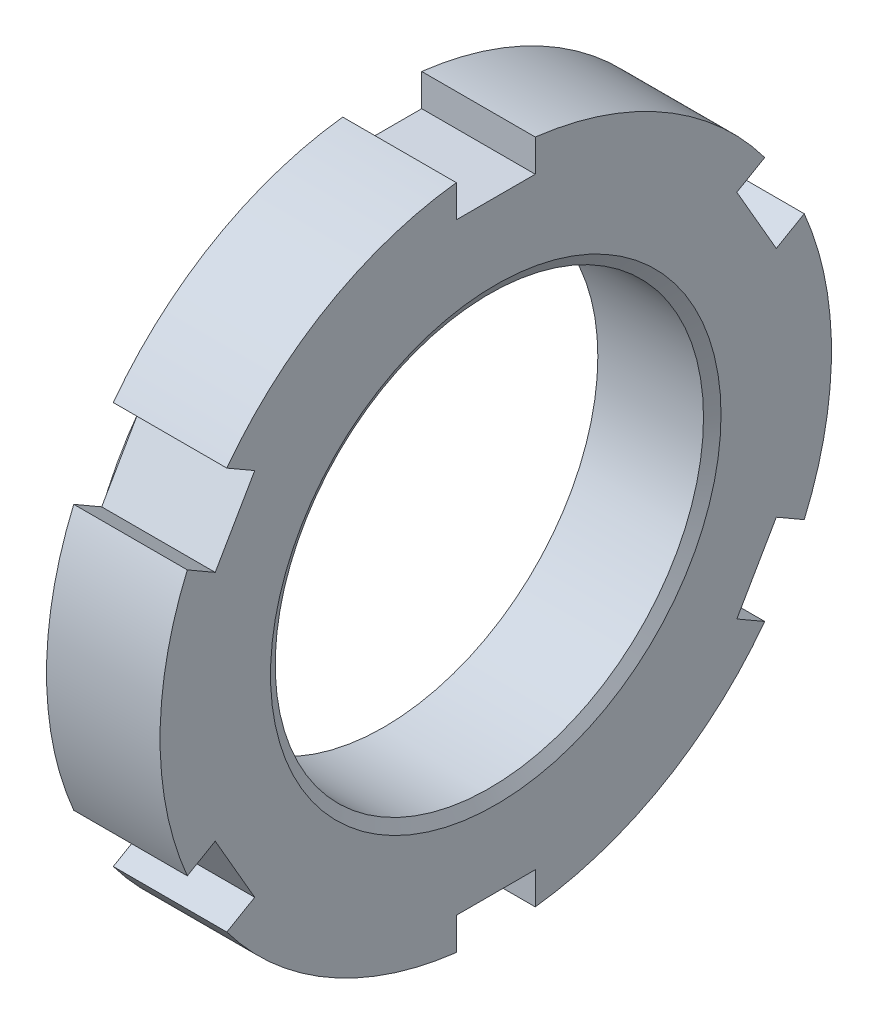
ISO-10303-21;
HEADER;
FILE_DESCRIPTION(('STEP AP214'),'2;1');
FILE_NAME('part.step','',(''),(''),'','','');
FILE_SCHEMA(('AUTOMOTIVE_DESIGN { 1 0 10303 214 1 1 1 1 }'));
ENDSEC;
DATA;
#1=APPLICATION_CONTEXT('core data for automotive mechanical design processes');
#2=APPLICATION_PROTOCOL_DEFINITION('international standard','automotive_design',2000,#1);
#3=PRODUCT_CONTEXT('',#1,'mechanical');
#4=PRODUCT('Part','Part','',(#3));
#5=PRODUCT_RELATED_PRODUCT_CATEGORY('part','',(#4));
#6=PRODUCT_DEFINITION_FORMATION('','',#4);
#7=PRODUCT_DEFINITION_CONTEXT('part definition',#1,'design');
#8=PRODUCT_DEFINITION('design','',#6,#7);
#9=PRODUCT_DEFINITION_SHAPE('','',#8);
#10=(LENGTH_UNIT() NAMED_UNIT(*) SI_UNIT(.MILLI.,.METRE.));
#11=(NAMED_UNIT(*) PLANE_ANGLE_UNIT() SI_UNIT($,.RADIAN.));
#12=(NAMED_UNIT(*) SI_UNIT($,.STERADIAN.) SOLID_ANGLE_UNIT());
#13=UNCERTAINTY_MEASURE_WITH_UNIT(LENGTH_MEASURE(1.E-05),#10,'distance_accuracy_value','');
#14=(GEOMETRIC_REPRESENTATION_CONTEXT(3) GLOBAL_UNCERTAINTY_ASSIGNED_CONTEXT((#13)) GLOBAL_UNIT_ASSIGNED_CONTEXT((#10,
#11,#12)) REPRESENTATION_CONTEXT('',''));
#15=CARTESIAN_POINT('',(0.,0.,0.));
#16=DIRECTION('',(0.,0.,1.));
#17=DIRECTION('',(1.,0.,0.));
#18=AXIS2_PLACEMENT_3D('',#15,#16,#17);
#19=CARTESIAN_POINT('',(0.5,32.,0.));
#20=DIRECTION('',(-1.,0.,0.));
#21=DIRECTION('',(0.,0.,1.));
#22=AXIS2_PLACEMENT_3D('',#19,#20,#21);
#23=PLANE('',#22);
#24=CARTESIAN_POINT('',(0.5,0.,0.));
#25=DIRECTION('',(1.,0.,0.));
#26=DIRECTION('',(0.,1.,0.));
#27=AXIS2_PLACEMENT_3D('',#24,#25,#26);
#28=CIRCLE('',#27,30.);
#29=CARTESIAN_POINT('',(0.5,-30.,0.));
#30=VERTEX_POINT('',#29);
#31=EDGE_CURVE('E28',#30,#30,#28,.T.);
#32=ORIENTED_EDGE('',*,*,#31,.T.);
#33=EDGE_LOOP('',(#32));
#34=FACE_BOUND('',#33,.T.);
#35=DIRECTION('',(0.,-0.5,-0.866025403784439));
#36=VECTOR('',#35,1.);
#37=CARTESIAN_POINT('',(0.5,-7.08910161513776,-4.27868417743718));
#38=LINE('',#37,#36);
#39=CARTESIAN_POINT('',(0.5,-18.7141016151378,-24.4137748154254));
#40=VERTEX_POINT('',#39);
#41=CARTESIAN_POINT('',(0.5,-20.3460446312719,-27.2403830344269));
#42=VERTEX_POINT('',#41);
#43=EDGE_CURVE('E310',#40,#42,#38,.T.);
#44=ORIENTED_EDGE('',*,*,#43,.T.);
#45=CARTESIAN_POINT('',(0.5,0.,0.));
#46=DIRECTION('',(1.,0.,0.));
#47=DIRECTION('',(0.,1.,0.));
#48=AXIS2_PLACEMENT_3D('',#45,#46,#47);
#49=CIRCLE('',#48,34.);
#50=CARTESIAN_POINT('',(0.5,-33.7638860322683,-4.));
#51=VERTEX_POINT('',#50);
#52=EDGE_CURVE('E332',#51,#42,#49,.T.);
#53=ORIENTED_EDGE('',*,*,#52,.F.);
#54=DIRECTION('',(0.,1.,0.));
#55=VECTOR('',#54,1.);
#56=CARTESIAN_POINT('',(0.5,-0.881943016134133,-4.));
#57=LINE('',#56,#55);
#58=CARTESIAN_POINT('',(0.5,-30.5,-4.));
#59=VERTEX_POINT('',#58);
#60=EDGE_CURVE('E322',#51,#59,#57,.T.);
#61=ORIENTED_EDGE('',*,*,#60,.T.);
#62=DIRECTION('',(0.,0.,1.));
#63=VECTOR('',#62,1.);
#64=CARTESIAN_POINT('',(0.5,-30.5,-2.));
#65=LINE('',#64,#63);
#66=CARTESIAN_POINT('',(0.5,-30.5,4.));
#67=VERTEX_POINT('',#66);
#68=EDGE_CURVE('E248',#59,#67,#65,.T.);
#69=ORIENTED_EDGE('',*,*,#68,.T.);
#70=DIRECTION('',(0.,-1.,0.));
#71=VECTOR('',#70,1.);
#72=CARTESIAN_POINT('',(0.5,0.75,4.));
#73=LINE('',#72,#71);
#74=CARTESIAN_POINT('',(0.5,-33.7638860322683,4.));
#75=VERTEX_POINT('',#74);
#76=EDGE_CURVE('E413',#67,#75,#73,.T.);
#77=ORIENTED_EDGE('',*,*,#76,.T.);
#78=CARTESIAN_POINT('',(0.5,0.,0.));
#79=DIRECTION('',(1.,0.,0.));
#80=DIRECTION('',(0.,1.,0.));
#81=AXIS2_PLACEMENT_3D('',#78,#79,#80);
#82=CIRCLE('',#81,34.);
#83=CARTESIAN_POINT('',(0.5,-20.3460446312719,27.2403830344269));
#84=VERTEX_POINT('',#83);
#85=EDGE_CURVE('E293',#84,#75,#82,.T.);
#86=ORIENTED_EDGE('',*,*,#85,.F.);
#87=DIRECTION('',(0.,0.5,-0.866025403784439));
#88=VECTOR('',#87,1.);
#89=CARTESIAN_POINT('',(0.5,-7.90507312320482,5.69198828693794));
#90=LINE('',#89,#88);
#91=CARTESIAN_POINT('',(0.5,-18.7141016151378,24.4137748154254));
#92=VERTEX_POINT('',#91);
#93=EDGE_CURVE('E226',#84,#92,#90,.T.);
#94=ORIENTED_EDGE('',*,*,#93,.T.);
#95=DIRECTION('',(0.,0.866025403784439,0.5));
#96=VECTOR('',#95,1.);
#97=CARTESIAN_POINT('',(0.5,-4.98205080756887,32.3419780457009));
#98=LINE('',#97,#96);
#99=CARTESIAN_POINT('',(0.5,-11.7858983848622,28.4137748154254));
#100=VERTEX_POINT('',#99);
#101=EDGE_CURVE('E267',#92,#100,#98,.T.);
#102=ORIENTED_EDGE('',*,*,#101,.T.);
#103=DIRECTION('',(0.,-0.5,0.866025403784439));
#104=VECTOR('',#103,1.);
#105=CARTESIAN_POINT('',(0.5,-0.160898384862247,8.27868417743719));
#106=LINE('',#105,#104);
#107=CARTESIAN_POINT('',(0.5,-13.4178414009964,31.2403830344269));
#108=VERTEX_POINT('',#107);
#109=EDGE_CURVE('E442',#100,#108,#106,.T.);
#110=ORIENTED_EDGE('',*,*,#109,.T.);
#111=CARTESIAN_POINT('',(0.5,0.,0.));
#112=DIRECTION('',(1.,0.,0.));
#113=DIRECTION('',(0.,1.,0.));
#114=AXIS2_PLACEMENT_3D('',#111,#112,#113);
#115=CIRCLE('',#114,34.);
#116=CARTESIAN_POINT('',(0.5,13.4178414009964,31.2403830344269));
#117=VERTEX_POINT('',#116);
#118=EDGE_CURVE('E290',#117,#108,#115,.T.);
#119=ORIENTED_EDGE('',*,*,#118,.F.);
#120=DIRECTION('',(0.,-0.5,-0.866025403784439));
#121=VECTOR('',#120,1.);
#122=CARTESIAN_POINT('',(0.5,8.97686989292931,23.548394747489));
#123=LINE('',#122,#121);
#124=CARTESIAN_POINT('',(0.5,11.7858983848623,28.4137748154254));
#125=VERTEX_POINT('',#124);
#126=EDGE_CURVE('E198',#117,#125,#123,.T.);
#127=ORIENTED_EDGE('',*,*,#126,.T.);
#128=DIRECTION('',(0.,0.866025403784439,-0.5));
#129=VECTOR('',#128,1.);
#130=CARTESIAN_POINT('',(0.5,25.5179491924311,20.4855715851499));
#131=LINE('',#130,#129);
#132=CARTESIAN_POINT('',(0.5,18.7141016151378,24.4137748154254));
#133=VERTEX_POINT('',#132);
#134=EDGE_CURVE('E190',#125,#133,#131,.T.);
#135=ORIENTED_EDGE('',*,*,#134,.T.);
#136=DIRECTION('',(0.,0.5,0.866025403784439));
#137=VECTOR('',#136,1.);
#138=CARTESIAN_POINT('',(0.5,15.0891016151378,18.1350906379882));
#139=LINE('',#138,#137);
#140=CARTESIAN_POINT('',(0.5,20.3460446312719,27.2403830344269));
#141=VERTEX_POINT('',#140);
#142=EDGE_CURVE('E195',#133,#141,#139,.T.);
#143=ORIENTED_EDGE('',*,*,#142,.T.);
#144=CARTESIAN_POINT('',(0.5,0.,0.));
#145=DIRECTION('',(1.,0.,0.));
#146=DIRECTION('',(0.,1.,0.));
#147=AXIS2_PLACEMENT_3D('',#144,#145,#146);
#148=CIRCLE('',#147,34.);
#149=CARTESIAN_POINT('',(0.5,33.7638860322683,4.));
#150=VERTEX_POINT('',#149);
#151=EDGE_CURVE('E294',#150,#141,#148,.T.);
#152=ORIENTED_EDGE('',*,*,#151,.F.);
#153=DIRECTION('',(0.,-1.,0.));
#154=VECTOR('',#153,1.);
#155=CARTESIAN_POINT('',(0.5,32.8819430161341,4.));
#156=LINE('',#155,#154);
#157=CARTESIAN_POINT('',(0.5,30.5,4.));
#158=VERTEX_POINT('',#157);
#159=EDGE_CURVE('E299',#150,#158,#156,.T.);
#160=ORIENTED_EDGE('',*,*,#159,.T.);
#161=DIRECTION('',(0.,0.,-1.));
#162=VECTOR('',#161,1.);
#163=CARTESIAN_POINT('',(0.5,30.5,2.));
#164=LINE('',#163,#162);
#165=CARTESIAN_POINT('',(0.5,30.5,-4.));
#166=VERTEX_POINT('',#165);
#167=EDGE_CURVE('E300',#158,#166,#164,.T.);
#168=ORIENTED_EDGE('',*,*,#167,.T.);
#169=DIRECTION('',(0.,1.,0.));
#170=VECTOR('',#169,1.);
#171=CARTESIAN_POINT('',(0.5,31.25,-4.));
#172=LINE('',#171,#170);
#173=CARTESIAN_POINT('',(0.5,33.7638860322683,-4.));
#174=VERTEX_POINT('',#173);
#175=EDGE_CURVE('E417',#166,#174,#172,.T.);
#176=ORIENTED_EDGE('',*,*,#175,.T.);
#177=CARTESIAN_POINT('',(0.5,0.,0.));
#178=DIRECTION('',(1.,0.,0.));
#179=DIRECTION('',(0.,1.,0.));
#180=AXIS2_PLACEMENT_3D('',#177,#178,#179);
#181=CIRCLE('',#180,34.);
#182=CARTESIAN_POINT('',(0.5,20.3460446312719,-27.2403830344269));
#183=VERTEX_POINT('',#182);
#184=EDGE_CURVE('E301',#183,#174,#181,.T.);
#185=ORIENTED_EDGE('',*,*,#184,.F.);
#186=DIRECTION('',(0.,-0.5,0.866025403784439));
#187=VECTOR('',#186,1.);
#188=CARTESIAN_POINT('',(0.5,15.9050731232048,-19.548394747489));
#189=LINE('',#188,#187);
#190=CARTESIAN_POINT('',(0.5,18.7141016151377,-24.4137748154254));
#191=VERTEX_POINT('',#190);
#192=EDGE_CURVE('E283',#183,#191,#189,.T.);
#193=ORIENTED_EDGE('',*,*,#192,.T.);
#194=DIRECTION('',(0.,-0.866025403784439,-0.5));
#195=VECTOR('',#194,1.);
#196=CARTESIAN_POINT('',(0.5,28.9820508075689,-18.4855715851499));
#197=LINE('',#196,#195);
#198=CARTESIAN_POINT('',(0.5,11.7858983848622,-28.4137748154254));
#199=VERTEX_POINT('',#198);
#200=EDGE_CURVE('E284',#191,#199,#197,.T.);
#201=ORIENTED_EDGE('',*,*,#200,.T.);
#202=DIRECTION('',(0.,0.5,-0.866025403784439));
#203=VECTOR('',#202,1.);
#204=CARTESIAN_POINT('',(0.5,8.16089838486222,-22.1350906379882));
#205=LINE('',#204,#203);
#206=CARTESIAN_POINT('',(0.5,13.4178414009964,-31.2403830344269));
#207=VERTEX_POINT('',#206);
#208=EDGE_CURVE('E235',#199,#207,#205,.T.);
#209=ORIENTED_EDGE('',*,*,#208,.T.);
#210=CARTESIAN_POINT('',(0.5,0.,0.));
#211=DIRECTION('',(1.,0.,0.));
#212=DIRECTION('',(0.,1.,0.));
#213=AXIS2_PLACEMENT_3D('',#210,#211,#212);
#214=CIRCLE('',#213,34.);
#215=CARTESIAN_POINT('',(0.5,-13.4178414009964,-31.2403830344269));
#216=VERTEX_POINT('',#215);
#217=EDGE_CURVE('E414',#216,#207,#214,.T.);
#218=ORIENTED_EDGE('',*,*,#217,.F.);
#219=DIRECTION('',(0.,0.5,0.866025403784439));
#220=VECTOR('',#219,1.);
#221=CARTESIAN_POINT('',(0.5,-0.976869892929313,-9.69198828693793));
#222=LINE('',#221,#220);
#223=CARTESIAN_POINT('',(0.5,-11.7858983848623,-28.4137748154254));
#224=VERTEX_POINT('',#223);
#225=EDGE_CURVE('E273',#216,#224,#222,.T.);
#226=ORIENTED_EDGE('',*,*,#225,.T.);
#227=DIRECTION('',(0.,-0.866025403784439,0.5));
#228=VECTOR('',#227,1.);
#229=CARTESIAN_POINT('',(0.5,-1.51794919243114,-34.3419780457009));
#230=LINE('',#229,#228);
#231=EDGE_CURVE('E246',#224,#40,#230,.T.);
#232=ORIENTED_EDGE('',*,*,#231,.T.);
#233=EDGE_LOOP('',(#44,#53,#61,#69,#77,#86,#94,#102,#110,#119,#127,#135,#143,#152,#160,#168,
#176,#185,#193,#201,#209,#218,#226,#232));
#234=FACE_BOUND('',#233,.T.);
#235=ADVANCED_FACE('F17',(#34,#234),#23,.T.);
#236=CARTESIAN_POINT('',(0.25,0.,0.));
#237=DIRECTION('',(1.,0.,0.));
#238=DIRECTION('',(0.,1.,0.));
#239=AXIS2_PLACEMENT_3D('',#236,#237,#238);
#240=CYLINDRICAL_SURFACE('',#239,30.);
#241=ORIENTED_EDGE('',*,*,#31,.F.);
#242=DIRECTION('',(-1.,0.,0.));
#243=VECTOR('',#242,1.);
#244=CARTESIAN_POINT('',(0.25,-30.,0.));
#245=LINE('',#244,#243);
#246=CARTESIAN_POINT('',(0.,-30.,0.));
#247=VERTEX_POINT('',#246);
#248=EDGE_CURVE('E11',#30,#247,#245,.T.);
#249=ORIENTED_EDGE('',*,*,#248,.T.);
#250=CARTESIAN_POINT('',(0.,0.,0.));
#251=DIRECTION('',(1.,0.,0.));
#252=DIRECTION('',(0.,1.,0.));
#253=AXIS2_PLACEMENT_3D('',#250,#251,#252);
#254=CIRCLE('',#253,30.);
#255=EDGE_CURVE('E364',#247,#247,#254,.T.);
#256=ORIENTED_EDGE('',*,*,#255,.T.);
#257=ORIENTED_EDGE('',*,*,#248,.F.);
#258=EDGE_LOOP('',(#241,#249,#256,#257));
#259=FACE_BOUND('',#258,.T.);
#260=ADVANCED_FACE('F649',(#259),#240,.T.);
#261=CARTESIAN_POINT('',(6.25,0.,0.));
#262=DIRECTION('',(1.,0.,0.));
#263=DIRECTION('',(0.,1.,0.));
#264=AXIS2_PLACEMENT_3D('',#261,#262,#263);
#265=CYLINDRICAL_SURFACE('',#264,34.);
#266=DIRECTION('',(1.,0.,0.));
#267=VECTOR('',#266,1.);
#268=CARTESIAN_POINT('',(6.25,-20.3460446312719,-27.2403830344269));
#269=LINE('',#268,#267);
#270=CARTESIAN_POINT('',(12.,-20.3460446312719,-27.2403830344269));
#271=VERTEX_POINT('',#270);
#272=EDGE_CURVE('E242',#42,#271,#269,.T.);
#273=ORIENTED_EDGE('',*,*,#272,.T.);
#274=CARTESIAN_POINT('',(12.,0.,0.));
#275=DIRECTION('',(1.,0.,0.));
#276=DIRECTION('',(0.,1.,0.));
#277=AXIS2_PLACEMENT_3D('',#274,#275,#276);
#278=CIRCLE('',#277,34.);
#279=CARTESIAN_POINT('',(12.,-33.7638860322683,-4.));
#280=VERTEX_POINT('',#279);
#281=EDGE_CURVE('E347',#280,#271,#278,.T.);
#282=ORIENTED_EDGE('',*,*,#281,.F.);
#283=DIRECTION('',(-1.,0.,0.));
#284=VECTOR('',#283,1.);
#285=CARTESIAN_POINT('',(6.25,-33.7638860322683,-4.));
#286=LINE('',#285,#284);
#287=EDGE_CURVE('E446',#280,#51,#286,.T.);
#288=ORIENTED_EDGE('',*,*,#287,.T.);
#289=ORIENTED_EDGE('',*,*,#52,.T.);
#290=EDGE_LOOP('',(#273,#282,#288,#289));
#291=FACE_BOUND('',#290,.T.);
#292=ADVANCED_FACE('F611',(#291),#265,.T.);
#293=CARTESIAN_POINT('',(12.,33.7638860322683,4.));
#294=DIRECTION('',(0.,0.,1.));
#295=DIRECTION('',(1.,0.,0.));
#296=AXIS2_PLACEMENT_3D('',#293,#294,#295);
#297=PLANE('',#296);
#298=ORIENTED_EDGE('',*,*,#159,.F.);
#299=DIRECTION('',(-1.,0.,0.));
#300=VECTOR('',#299,1.);
#301=CARTESIAN_POINT('',(6.25,33.7638860322683,4.));
#302=LINE('',#301,#300);
#303=CARTESIAN_POINT('',(12.,33.7638860322683,4.));
#304=VERTEX_POINT('',#303);
#305=EDGE_CURVE('E315',#304,#150,#302,.T.);
#306=ORIENTED_EDGE('',*,*,#305,.F.);
#307=DIRECTION('',(0.,1.,0.));
#308=VECTOR('',#307,1.);
#309=CARTESIAN_POINT('',(12.,25.3819430161341,4.));
#310=LINE('',#309,#308);
#311=CARTESIAN_POINT('',(12.,30.5,4.));
#312=VERTEX_POINT('',#311);
#313=EDGE_CURVE('E236',#312,#304,#310,.T.);
#314=ORIENTED_EDGE('',*,*,#313,.F.);
#315=DIRECTION('',(-1.,0.,0.));
#316=VECTOR('',#315,1.);
#317=CARTESIAN_POINT('',(12.,30.5,4.));
#318=LINE('',#317,#316);
#319=EDGE_CURVE('E295',#312,#158,#318,.T.);
#320=ORIENTED_EDGE('',*,*,#319,.T.);
#321=EDGE_LOOP('',(#298,#306,#314,#320));
#322=FACE_BOUND('',#321,.T.);
#323=ADVANCED_FACE('F709',(#322),#297,.F.);
#324=CARTESIAN_POINT('',(12.,30.5,4.));
#325=DIRECTION('',(0.,-1.,0.));
#326=DIRECTION('',(0.,0.,-1.));
#327=AXIS2_PLACEMENT_3D('',#324,#325,#326);
#328=PLANE('',#327);
#329=ORIENTED_EDGE('',*,*,#167,.F.);
#330=ORIENTED_EDGE('',*,*,#319,.F.);
#331=DIRECTION('',(0.,0.,1.));
#332=VECTOR('',#331,1.);
#333=CARTESIAN_POINT('',(12.,30.5,2.));
#334=LINE('',#333,#332);
#335=CARTESIAN_POINT('',(12.,30.5,-4.));
#336=VERTEX_POINT('',#335);
#337=EDGE_CURVE('E240',#336,#312,#334,.T.);
#338=ORIENTED_EDGE('',*,*,#337,.F.);
#339=DIRECTION('',(-1.,0.,0.));
#340=VECTOR('',#339,1.);
#341=CARTESIAN_POINT('',(12.,30.5,-4.));
#342=LINE('',#341,#340);
#343=EDGE_CURVE('E331',#336,#166,#342,.T.);
#344=ORIENTED_EDGE('',*,*,#343,.T.);
#345=EDGE_LOOP('',(#329,#330,#338,#344));
#346=FACE_BOUND('',#345,.T.);
#347=ADVANCED_FACE('F644',(#346),#328,.F.);
#348=CARTESIAN_POINT('',(12.,30.5,-4.));
#349=DIRECTION('',(0.,0.,-1.));
#350=DIRECTION('',(0.,-1.,0.));
#351=AXIS2_PLACEMENT_3D('',#348,#349,#350);
#352=PLANE('',#351);
#353=ORIENTED_EDGE('',*,*,#175,.F.);
#354=ORIENTED_EDGE('',*,*,#343,.F.);
#355=DIRECTION('',(0.,-1.,0.));
#356=VECTOR('',#355,1.);
#357=CARTESIAN_POINT('',(12.,23.75,-4.));
#358=LINE('',#357,#356);
#359=CARTESIAN_POINT('',(12.,33.7638860322683,-4.));
#360=VERTEX_POINT('',#359);
#361=EDGE_CURVE('E254',#360,#336,#358,.T.);
#362=ORIENTED_EDGE('',*,*,#361,.F.);
#363=DIRECTION('',(1.,0.,0.));
#364=VECTOR('',#363,1.);
#365=CARTESIAN_POINT('',(6.25,33.7638860322683,-4.));
#366=LINE('',#365,#364);
#367=EDGE_CURVE('E305',#174,#360,#366,.T.);
#368=ORIENTED_EDGE('',*,*,#367,.F.);
#369=EDGE_LOOP('',(#353,#354,#362,#368));
#370=FACE_BOUND('',#369,.T.);
#371=ADVANCED_FACE('F634',(#370),#352,.F.);
#372=CARTESIAN_POINT('',(6.25,0.,0.));
#373=DIRECTION('',(1.,0.,0.));
#374=DIRECTION('',(0.,1.,0.));
#375=AXIS2_PLACEMENT_3D('',#372,#373,#374);
#376=CYLINDRICAL_SURFACE('',#375,34.);
#377=DIRECTION('',(-1.,0.,0.));
#378=VECTOR('',#377,1.);
#379=CARTESIAN_POINT('',(6.25,-13.4178414009964,-31.2403830344269));
#380=LINE('',#379,#378);
#381=CARTESIAN_POINT('',(12.,-13.4178414009964,-31.2403830344269));
#382=VERTEX_POINT('',#381);
#383=EDGE_CURVE('E277',#382,#216,#380,.T.);
#384=ORIENTED_EDGE('',*,*,#383,.T.);
#385=ORIENTED_EDGE('',*,*,#217,.T.);
#386=DIRECTION('',(1.,0.,0.));
#387=VECTOR('',#386,1.);
#388=CARTESIAN_POINT('',(6.25,13.4178414009964,-31.2403830344269));
#389=LINE('',#388,#387);
#390=CARTESIAN_POINT('',(12.,13.4178414009964,-31.2403830344269));
#391=VERTEX_POINT('',#390);
#392=EDGE_CURVE('E311',#207,#391,#389,.T.);
#393=ORIENTED_EDGE('',*,*,#392,.T.);
#394=CARTESIAN_POINT('',(12.,0.,0.));
#395=DIRECTION('',(1.,0.,0.));
#396=DIRECTION('',(0.,1.,0.));
#397=AXIS2_PLACEMENT_3D('',#394,#395,#396);
#398=CIRCLE('',#397,34.);
#399=EDGE_CURVE('E328',#382,#391,#398,.T.);
#400=ORIENTED_EDGE('',*,*,#399,.F.);
#401=EDGE_LOOP('',(#384,#385,#393,#400));
#402=FACE_BOUND('',#401,.T.);
#403=ADVANCED_FACE('F631',(#402),#376,.T.);
#404=CARTESIAN_POINT('',(6.25,0.,0.));
#405=DIRECTION('',(1.,0.,0.));
#406=DIRECTION('',(0.,1.,0.));
#407=AXIS2_PLACEMENT_3D('',#404,#405,#406);
#408=CYLINDRICAL_SURFACE('',#407,34.);
#409=DIRECTION('',(1.,0.,0.));
#410=VECTOR('',#409,1.);
#411=CARTESIAN_POINT('',(6.25,-33.7638860322683,4.));
#412=LINE('',#411,#410);
#413=CARTESIAN_POINT('',(12.,-33.7638860322683,4.));
#414=VERTEX_POINT('',#413);
#415=EDGE_CURVE('E253',#75,#414,#412,.T.);
#416=ORIENTED_EDGE('',*,*,#415,.T.);
#417=CARTESIAN_POINT('',(12.,0.,0.));
#418=DIRECTION('',(1.,0.,0.));
#419=DIRECTION('',(0.,1.,0.));
#420=AXIS2_PLACEMENT_3D('',#417,#418,#419);
#421=CIRCLE('',#420,34.);
#422=CARTESIAN_POINT('',(12.,-20.3460446312719,27.2403830344269));
#423=VERTEX_POINT('',#422);
#424=EDGE_CURVE('E376',#423,#414,#421,.T.);
#425=ORIENTED_EDGE('',*,*,#424,.F.);
#426=DIRECTION('',(-1.,0.,0.));
#427=VECTOR('',#426,1.);
#428=CARTESIAN_POINT('',(6.25,-20.3460446312719,27.2403830344269));
#429=LINE('',#428,#427);
#430=EDGE_CURVE('E219',#423,#84,#429,.T.);
#431=ORIENTED_EDGE('',*,*,#430,.T.);
#432=ORIENTED_EDGE('',*,*,#85,.T.);
#433=EDGE_LOOP('',(#416,#425,#431,#432));
#434=FACE_BOUND('',#433,.T.);
#435=ADVANCED_FACE('F633',(#434),#408,.T.);
#436=CARTESIAN_POINT('',(6.25,0.,0.));
#437=DIRECTION('',(1.,0.,0.));
#438=DIRECTION('',(0.,1.,0.));
#439=AXIS2_PLACEMENT_3D('',#436,#437,#438);
#440=CYLINDRICAL_SURFACE('',#439,34.);
#441=DIRECTION('',(1.,0.,0.));
#442=VECTOR('',#441,1.);
#443=CARTESIAN_POINT('',(6.25,-13.4178414009964,31.2403830344269));
#444=LINE('',#443,#442);
#445=CARTESIAN_POINT('',(12.,-13.4178414009964,31.2403830344269));
#446=VERTEX_POINT('',#445);
#447=EDGE_CURVE('E151',#108,#446,#444,.T.);
#448=ORIENTED_EDGE('',*,*,#447,.T.);
#449=CARTESIAN_POINT('',(12.,0.,0.));
#450=DIRECTION('',(1.,0.,0.));
#451=DIRECTION('',(0.,1.,0.));
#452=AXIS2_PLACEMENT_3D('',#449,#450,#451);
#453=CIRCLE('',#452,34.);
#454=CARTESIAN_POINT('',(12.,13.4178414009964,31.2403830344269));
#455=VERTEX_POINT('',#454);
#456=EDGE_CURVE('E289',#455,#446,#453,.T.);
#457=ORIENTED_EDGE('',*,*,#456,.F.);
#458=DIRECTION('',(-1.,0.,0.));
#459=VECTOR('',#458,1.);
#460=CARTESIAN_POINT('',(6.25,13.4178414009964,31.2403830344269));
#461=LINE('',#460,#459);
#462=EDGE_CURVE('E232',#455,#117,#461,.T.);
#463=ORIENTED_EDGE('',*,*,#462,.T.);
#464=ORIENTED_EDGE('',*,*,#118,.T.);
#465=EDGE_LOOP('',(#448,#457,#463,#464));
#466=FACE_BOUND('',#465,.T.);
#467=ADVANCED_FACE('F641',(#466),#440,.T.);
#468=CARTESIAN_POINT('',(6.25,0.,0.));
#469=DIRECTION('',(1.,0.,0.));
#470=DIRECTION('',(0.,1.,0.));
#471=AXIS2_PLACEMENT_3D('',#468,#469,#470);
#472=CYLINDRICAL_SURFACE('',#471,34.);
#473=DIRECTION('',(1.,0.,0.));
#474=VECTOR('',#473,1.);
#475=CARTESIAN_POINT('',(6.25,20.3460446312719,27.2403830344269));
#476=LINE('',#475,#474);
#477=CARTESIAN_POINT('',(12.,20.3460446312719,27.2403830344269));
#478=VERTEX_POINT('',#477);
#479=EDGE_CURVE('E204',#141,#478,#476,.T.);
#480=ORIENTED_EDGE('',*,*,#479,.T.);
#481=CARTESIAN_POINT('',(12.,0.,0.));
#482=DIRECTION('',(1.,0.,0.));
#483=DIRECTION('',(0.,1.,0.));
#484=AXIS2_PLACEMENT_3D('',#481,#482,#483);
#485=CIRCLE('',#484,34.);
#486=EDGE_CURVE('E239',#304,#478,#485,.T.);
#487=ORIENTED_EDGE('',*,*,#486,.F.);
#488=ORIENTED_EDGE('',*,*,#305,.T.);
#489=ORIENTED_EDGE('',*,*,#151,.T.);
#490=EDGE_LOOP('',(#480,#487,#488,#489));
#491=FACE_BOUND('',#490,.T.);
#492=ADVANCED_FACE('F512',(#491),#472,.T.);
#493=CARTESIAN_POINT('',(6.25,0.,0.));
#494=DIRECTION('',(1.,0.,0.));
#495=DIRECTION('',(0.,1.,0.));
#496=AXIS2_PLACEMENT_3D('',#493,#494,#495);
#497=CYLINDRICAL_SURFACE('',#496,34.);
#498=DIRECTION('',(-1.,0.,0.));
#499=VECTOR('',#498,1.);
#500=CARTESIAN_POINT('',(6.25,20.3460446312719,-27.2403830344269));
#501=LINE('',#500,#499);
#502=CARTESIAN_POINT('',(12.,20.3460446312719,-27.2403830344269));
#503=VERTEX_POINT('',#502);
#504=EDGE_CURVE('E306',#503,#183,#501,.T.);
#505=ORIENTED_EDGE('',*,*,#504,.T.);
#506=ORIENTED_EDGE('',*,*,#184,.T.);
#507=ORIENTED_EDGE('',*,*,#367,.T.);
#508=CARTESIAN_POINT('',(12.,0.,0.));
#509=DIRECTION('',(1.,0.,0.));
#510=DIRECTION('',(0.,1.,0.));
#511=AXIS2_PLACEMENT_3D('',#508,#509,#510);
#512=CIRCLE('',#511,34.);
#513=EDGE_CURVE('E258',#503,#360,#512,.T.);
#514=ORIENTED_EDGE('',*,*,#513,.F.);
#515=EDGE_LOOP('',(#505,#506,#507,#514));
#516=FACE_BOUND('',#515,.T.);
#517=ADVANCED_FACE('F689',(#516),#497,.T.);
#518=CARTESIAN_POINT('',(12.,20.3460446312719,-27.2403830344269));
#519=DIRECTION('',(0.,0.866025403784439,0.5));
#520=DIRECTION('',(1.,0.,0.));
#521=AXIS2_PLACEMENT_3D('',#518,#519,#520);
#522=PLANE('',#521);
#523=ORIENTED_EDGE('',*,*,#192,.F.);
#524=ORIENTED_EDGE('',*,*,#504,.F.);
#525=DIRECTION('',(0.,0.5,-0.866025403784439));
#526=VECTOR('',#525,1.);
#527=CARTESIAN_POINT('',(12.,14.0300731232048,-16.3007994832973));
#528=LINE('',#527,#526);
#529=CARTESIAN_POINT('',(12.,18.7141016151377,-24.4137748154254));
#530=VERTEX_POINT('',#529);
#531=EDGE_CURVE('E392',#530,#503,#528,.T.);
#532=ORIENTED_EDGE('',*,*,#531,.F.);
#533=DIRECTION('',(-1.,0.,0.));
#534=VECTOR('',#533,1.);
#535=CARTESIAN_POINT('',(12.,18.7141016151377,-24.4137748154254));
#536=LINE('',#535,#534);
#537=EDGE_CURVE('E279',#530,#191,#536,.T.);
#538=ORIENTED_EDGE('',*,*,#537,.T.);
#539=EDGE_LOOP('',(#523,#524,#532,#538));
#540=FACE_BOUND('',#539,.T.);
#541=ADVANCED_FACE('F593',(#540),#522,.F.);
#542=CARTESIAN_POINT('',(12.,18.7141016151377,-24.4137748154254));
#543=DIRECTION('',(0.,-0.5,0.866025403784439));
#544=DIRECTION('',(-1.,0.,0.));
#545=AXIS2_PLACEMENT_3D('',#542,#543,#544);
#546=PLANE('',#545);
#547=ORIENTED_EDGE('',*,*,#200,.F.);
#548=ORIENTED_EDGE('',*,*,#537,.F.);
#549=DIRECTION('',(0.,0.866025403784439,0.5));
#550=VECTOR('',#549,1.);
#551=CARTESIAN_POINT('',(12.,23.3570508075689,-21.7331668493415));
#552=LINE('',#551,#550);
#553=CARTESIAN_POINT('',(12.,11.7858983848622,-28.4137748154254));
#554=VERTEX_POINT('',#553);
#555=EDGE_CURVE('E327',#554,#530,#552,.T.);
#556=ORIENTED_EDGE('',*,*,#555,.F.);
#557=DIRECTION('',(-1.,0.,0.));
#558=VECTOR('',#557,1.);
#559=CARTESIAN_POINT('',(12.,11.7858983848622,-28.4137748154254));
#560=LINE('',#559,#558);
#561=EDGE_CURVE('E230',#554,#199,#560,.T.);
#562=ORIENTED_EDGE('',*,*,#561,.T.);
#563=EDGE_LOOP('',(#547,#548,#556,#562));
#564=FACE_BOUND('',#563,.T.);
#565=ADVANCED_FACE('F19',(#564),#546,.F.);
#566=CARTESIAN_POINT('',(12.,11.7858983848622,-28.4137748154254));
#567=DIRECTION('',(0.,-0.866025403784439,-0.5));
#568=DIRECTION('',(0.,0.5,-0.866025403784439));
#569=AXIS2_PLACEMENT_3D('',#566,#567,#568);
#570=PLANE('',#569);
#571=ORIENTED_EDGE('',*,*,#208,.F.);
#572=ORIENTED_EDGE('',*,*,#561,.F.);
#573=DIRECTION('',(0.,-0.5,0.866025403784439));
#574=VECTOR('',#573,1.);
#575=CARTESIAN_POINT('',(12.,6.28589838486223,-18.8874953737966));
#576=LINE('',#575,#574);
#577=EDGE_CURVE('E323',#391,#554,#576,.T.);
#578=ORIENTED_EDGE('',*,*,#577,.F.);
#579=ORIENTED_EDGE('',*,*,#392,.F.);
#580=EDGE_LOOP('',(#571,#572,#578,#579));
#581=FACE_BOUND('',#580,.T.);
#582=ADVANCED_FACE('F588',(#581),#570,.F.);
#583=CARTESIAN_POINT('',(12.,13.4178414009964,31.2403830344269));
#584=DIRECTION('',(0.,-0.866025403784439,0.5));
#585=DIRECTION('',(-1.,0.,0.));
#586=AXIS2_PLACEMENT_3D('',#583,#584,#585);
#587=PLANE('',#586);
#588=ORIENTED_EDGE('',*,*,#126,.F.);
#589=ORIENTED_EDGE('',*,*,#462,.F.);
#590=DIRECTION('',(0.,0.5,0.866025403784439));
#591=VECTOR('',#590,1.);
#592=CARTESIAN_POINT('',(12.,7.10186989292931,20.3007994832973));
#593=LINE('',#592,#591);
#594=CARTESIAN_POINT('',(12.,11.7858983848623,28.4137748154254));
#595=VERTEX_POINT('',#594);
#596=EDGE_CURVE('E285',#595,#455,#593,.T.);
#597=ORIENTED_EDGE('',*,*,#596,.F.);
#598=DIRECTION('',(-1.,0.,0.));
#599=VECTOR('',#598,1.);
#600=CARTESIAN_POINT('',(12.,11.7858983848623,28.4137748154254));
#601=LINE('',#600,#599);
#602=EDGE_CURVE('E203',#595,#125,#601,.T.);
#603=ORIENTED_EDGE('',*,*,#602,.T.);
#604=EDGE_LOOP('',(#588,#589,#597,#603));
#605=FACE_BOUND('',#604,.T.);
#606=ADVANCED_FACE('F674',(#605),#587,.F.);
#607=CARTESIAN_POINT('',(12.,11.7858983848623,28.4137748154254));
#608=DIRECTION('',(0.,-0.5,-0.866025403784439));
#609=DIRECTION('',(0.,-0.866025403784439,0.5));
#610=AXIS2_PLACEMENT_3D('',#607,#608,#609);
#611=PLANE('',#610);
#612=ORIENTED_EDGE('',*,*,#134,.F.);
#613=ORIENTED_EDGE('',*,*,#602,.F.);
#614=DIRECTION('',(0.,-0.866025403784439,0.5));
#615=VECTOR('',#614,1.);
#616=CARTESIAN_POINT('',(12.,19.8929491924311,23.7331668493415));
#617=LINE('',#616,#615);
#618=CARTESIAN_POINT('',(12.,18.7141016151378,24.4137748154254));
#619=VERTEX_POINT('',#618);
#620=EDGE_CURVE('E21',#619,#595,#617,.T.);
#621=ORIENTED_EDGE('',*,*,#620,.F.);
#622=DIRECTION('',(-1.,0.,0.));
#623=VECTOR('',#622,1.);
#624=CARTESIAN_POINT('',(12.,18.7141016151378,24.4137748154254));
#625=LINE('',#624,#623);
#626=EDGE_CURVE('E207',#619,#133,#625,.T.);
#627=ORIENTED_EDGE('',*,*,#626,.T.);
#628=EDGE_LOOP('',(#612,#613,#621,#627));
#629=FACE_BOUND('',#628,.T.);
#630=ADVANCED_FACE('F208',(#629),#611,.F.);
#631=CARTESIAN_POINT('',(12.,18.7141016151378,24.4137748154254));
#632=DIRECTION('',(0.,0.866025403784439,-0.5));
#633=DIRECTION('',(-1.,0.,0.));
#634=AXIS2_PLACEMENT_3D('',#631,#632,#633);
#635=PLANE('',#634);
#636=ORIENTED_EDGE('',*,*,#142,.F.);
#637=ORIENTED_EDGE('',*,*,#626,.F.);
#638=DIRECTION('',(0.,-0.5,-0.866025403784439));
#639=VECTOR('',#638,1.);
#640=CARTESIAN_POINT('',(12.,13.2141016151378,14.8874953737966));
#641=LINE('',#640,#639);
#642=EDGE_CURVE('E470',#478,#619,#641,.T.);
#643=ORIENTED_EDGE('',*,*,#642,.F.);
#644=ORIENTED_EDGE('',*,*,#479,.F.);
#645=EDGE_LOOP('',(#636,#637,#643,#644));
#646=FACE_BOUND('',#645,.T.);
#647=ADVANCED_FACE('F216',(#646),#635,.F.);
#648=CARTESIAN_POINT('',(12.,-20.3460446312719,27.2403830344269));
#649=DIRECTION('',(0.,-0.866025403784439,-0.5));
#650=DIRECTION('',(0.,0.5,-0.866025403784439));
#651=AXIS2_PLACEMENT_3D('',#648,#649,#650);
#652=PLANE('',#651);
#653=ORIENTED_EDGE('',*,*,#93,.F.);
#654=ORIENTED_EDGE('',*,*,#430,.F.);
#655=DIRECTION('',(0.,-0.5,0.866025403784439));
#656=VECTOR('',#655,1.);
#657=CARTESIAN_POINT('',(12.,-9.78007312320482,8.93958355112959));
#658=LINE('',#657,#656);
#659=CARTESIAN_POINT('',(12.,-18.7141016151378,24.4137748154254));
#660=VERTEX_POINT('',#659);
#661=EDGE_CURVE('E372',#660,#423,#658,.T.);
#662=ORIENTED_EDGE('',*,*,#661,.F.);
#663=DIRECTION('',(-1.,0.,0.));
#664=VECTOR('',#663,1.);
#665=CARTESIAN_POINT('',(12.,-18.7141016151378,24.4137748154254));
#666=LINE('',#665,#664);
#667=EDGE_CURVE('E449',#660,#92,#666,.T.);
#668=ORIENTED_EDGE('',*,*,#667,.T.);
#669=EDGE_LOOP('',(#653,#654,#662,#668));
#670=FACE_BOUND('',#669,.T.);
#671=ADVANCED_FACE('F669',(#670),#652,.F.);
#672=CARTESIAN_POINT('',(12.,-18.7141016151378,24.4137748154254));
#673=DIRECTION('',(0.,0.5,-0.866025403784439));
#674=DIRECTION('',(-1.,0.,0.));
#675=AXIS2_PLACEMENT_3D('',#672,#673,#674);
#676=PLANE('',#675);
#677=ORIENTED_EDGE('',*,*,#101,.F.);
#678=ORIENTED_EDGE('',*,*,#667,.F.);
#679=DIRECTION('',(0.,-0.866025403784439,-0.5));
#680=VECTOR('',#679,1.);
#681=CARTESIAN_POINT('',(12.,-10.6070508075689,29.0943827815093));
#682=LINE('',#681,#680);
#683=CARTESIAN_POINT('',(12.,-11.7858983848622,28.4137748154254));
#684=VERTEX_POINT('',#683);
#685=EDGE_CURVE('E377',#684,#660,#682,.T.);
#686=ORIENTED_EDGE('',*,*,#685,.F.);
#687=DIRECTION('',(-1.,0.,0.));
#688=VECTOR('',#687,1.);
#689=CARTESIAN_POINT('',(12.,-11.7858983848622,28.4137748154254));
#690=LINE('',#689,#688);
#691=EDGE_CURVE('E162',#684,#100,#690,.T.);
#692=ORIENTED_EDGE('',*,*,#691,.T.);
#693=EDGE_LOOP('',(#677,#678,#686,#692));
#694=FACE_BOUND('',#693,.T.);
#695=ADVANCED_FACE('F661',(#694),#676,.F.);
#696=CARTESIAN_POINT('',(12.,-11.7858983848622,28.4137748154254));
#697=DIRECTION('',(0.,0.866025403784439,0.5));
#698=DIRECTION('',(1.,0.,0.));
#699=AXIS2_PLACEMENT_3D('',#696,#697,#698);
#700=PLANE('',#699);
#701=ORIENTED_EDGE('',*,*,#109,.F.);
#702=ORIENTED_EDGE('',*,*,#691,.F.);
#703=DIRECTION('',(0.,0.5,-0.866025403784439));
#704=VECTOR('',#703,1.);
#705=CARTESIAN_POINT('',(12.,-2.03589838486224,11.5262794416288));
#706=LINE('',#705,#704);
#707=EDGE_CURVE('E338',#446,#684,#706,.T.);
#708=ORIENTED_EDGE('',*,*,#707,.F.);
#709=ORIENTED_EDGE('',*,*,#447,.F.);
#710=EDGE_LOOP('',(#701,#702,#708,#709));
#711=FACE_BOUND('',#710,.T.);
#712=ADVANCED_FACE('F658',(#711),#700,.F.);
#713=CARTESIAN_POINT('',(12.,-33.7638860322683,-4.));
#714=DIRECTION('',(0.,0.,-1.));
#715=DIRECTION('',(0.,-1.,0.));
#716=AXIS2_PLACEMENT_3D('',#713,#714,#715);
#717=PLANE('',#716);
#718=ORIENTED_EDGE('',*,*,#60,.F.);
#719=ORIENTED_EDGE('',*,*,#287,.F.);
#720=DIRECTION('',(0.,-1.,0.));
#721=VECTOR('',#720,1.);
#722=CARTESIAN_POINT('',(12.,-8.38194301613413,-4.));
#723=LINE('',#722,#721);
#724=CARTESIAN_POINT('',(12.,-30.5,-4.));
#725=VERTEX_POINT('',#724);
#726=EDGE_CURVE('E344',#725,#280,#723,.T.);
#727=ORIENTED_EDGE('',*,*,#726,.F.);
#728=DIRECTION('',(-1.,0.,0.));
#729=VECTOR('',#728,1.);
#730=CARTESIAN_POINT('',(12.,-30.5,-4.));
#731=LINE('',#730,#729);
#732=EDGE_CURVE('E252',#725,#59,#731,.T.);
#733=ORIENTED_EDGE('',*,*,#732,.T.);
#734=EDGE_LOOP('',(#718,#719,#727,#733));
#735=FACE_BOUND('',#734,.T.);
#736=ADVANCED_FACE('F609',(#735),#717,.F.);
#737=CARTESIAN_POINT('',(12.,-30.5,-4.));
#738=DIRECTION('',(0.,1.,0.));
#739=DIRECTION('',(0.,0.,-1.));
#740=AXIS2_PLACEMENT_3D('',#737,#738,#739);
#741=PLANE('',#740);
#742=ORIENTED_EDGE('',*,*,#68,.F.);
#743=ORIENTED_EDGE('',*,*,#732,.F.);
#744=DIRECTION('',(0.,0.,-1.));
#745=VECTOR('',#744,1.);
#746=CARTESIAN_POINT('',(12.,-30.5,-2.));
#747=LINE('',#746,#745);
#748=CARTESIAN_POINT('',(12.,-30.5,4.));
#749=VERTEX_POINT('',#748);
#750=EDGE_CURVE('E341',#749,#725,#747,.T.);
#751=ORIENTED_EDGE('',*,*,#750,.F.);
#752=DIRECTION('',(-1.,0.,0.));
#753=VECTOR('',#752,1.);
#754=CARTESIAN_POINT('',(12.,-30.5,4.));
#755=LINE('',#754,#753);
#756=EDGE_CURVE('E363',#749,#67,#755,.T.);
#757=ORIENTED_EDGE('',*,*,#756,.T.);
#758=EDGE_LOOP('',(#742,#743,#751,#757));
#759=FACE_BOUND('',#758,.T.);
#760=ADVANCED_FACE('F618',(#759),#741,.F.);
#761=CARTESIAN_POINT('',(12.,-30.5,4.));
#762=DIRECTION('',(0.,0.,1.));
#763=DIRECTION('',(0.,-1.,0.));
#764=AXIS2_PLACEMENT_3D('',#761,#762,#763);
#765=PLANE('',#764);
#766=ORIENTED_EDGE('',*,*,#76,.F.);
#767=ORIENTED_EDGE('',*,*,#756,.F.);
#768=DIRECTION('',(0.,1.,0.));
#769=VECTOR('',#768,1.);
#770=CARTESIAN_POINT('',(12.,-6.75,4.));
#771=LINE('',#770,#769);
#772=EDGE_CURVE('E345',#414,#749,#771,.T.);
#773=ORIENTED_EDGE('',*,*,#772,.F.);
#774=ORIENTED_EDGE('',*,*,#415,.F.);
#775=EDGE_LOOP('',(#766,#767,#773,#774));
#776=FACE_BOUND('',#775,.T.);
#777=ADVANCED_FACE('F625',(#776),#765,.F.);
#778=CARTESIAN_POINT('',(12.,-13.4178414009964,-31.2403830344269));
#779=DIRECTION('',(0.,0.866025403784439,-0.5));
#780=DIRECTION('',(-1.,0.,0.));
#781=AXIS2_PLACEMENT_3D('',#778,#779,#780);
#782=PLANE('',#781);
#783=ORIENTED_EDGE('',*,*,#225,.F.);
#784=ORIENTED_EDGE('',*,*,#383,.F.);
#785=DIRECTION('',(0.,-0.5,-0.866025403784439));
#786=VECTOR('',#785,1.);
#787=CARTESIAN_POINT('',(12.,-2.85186989292932,-12.9395835511296));
#788=LINE('',#787,#786);
#789=CARTESIAN_POINT('',(12.,-11.7858983848623,-28.4137748154254));
#790=VERTEX_POINT('',#789);
#791=EDGE_CURVE('E359',#790,#382,#788,.T.);
#792=ORIENTED_EDGE('',*,*,#791,.F.);
#793=DIRECTION('',(-1.,0.,0.));
#794=VECTOR('',#793,1.);
#795=CARTESIAN_POINT('',(12.,-11.7858983848623,-28.4137748154254));
#796=LINE('',#795,#794);
#797=EDGE_CURVE('E278',#790,#224,#796,.T.);
#798=ORIENTED_EDGE('',*,*,#797,.T.);
#799=EDGE_LOOP('',(#783,#784,#792,#798));
#800=FACE_BOUND('',#799,.T.);
#801=ADVANCED_FACE('F569',(#800),#782,.F.);
#802=CARTESIAN_POINT('',(12.,-11.7858983848623,-28.4137748154254));
#803=DIRECTION('',(0.,0.5,0.866025403784439));
#804=DIRECTION('',(1.,0.,0.));
#805=AXIS2_PLACEMENT_3D('',#802,#803,#804);
#806=PLANE('',#805);
#807=ORIENTED_EDGE('',*,*,#231,.F.);
#808=ORIENTED_EDGE('',*,*,#797,.F.);
#809=DIRECTION('',(0.,0.866025403784439,-0.5));
#810=VECTOR('',#809,1.);
#811=CARTESIAN_POINT('',(12.,-7.14294919243114,-31.0943827815092));
#812=LINE('',#811,#810);
#813=CARTESIAN_POINT('',(12.,-18.7141016151378,-24.4137748154254));
#814=VERTEX_POINT('',#813);
#815=EDGE_CURVE('E263',#814,#790,#812,.T.);
#816=ORIENTED_EDGE('',*,*,#815,.F.);
#817=DIRECTION('',(-1.,0.,0.));
#818=VECTOR('',#817,1.);
#819=CARTESIAN_POINT('',(12.,-18.7141016151378,-24.4137748154254));
#820=LINE('',#819,#818);
#821=EDGE_CURVE('E247',#814,#40,#820,.T.);
#822=ORIENTED_EDGE('',*,*,#821,.T.);
#823=EDGE_LOOP('',(#807,#808,#816,#822));
#824=FACE_BOUND('',#823,.T.);
#825=ADVANCED_FACE('F572',(#824),#806,.F.);
#826=CARTESIAN_POINT('',(12.,-18.7141016151378,-24.4137748154254));
#827=DIRECTION('',(0.,-0.866025403784439,0.5));
#828=DIRECTION('',(-1.,0.,0.));
#829=AXIS2_PLACEMENT_3D('',#826,#827,#828);
#830=PLANE('',#829);
#831=ORIENTED_EDGE('',*,*,#43,.F.);
#832=ORIENTED_EDGE('',*,*,#821,.F.);
#833=DIRECTION('',(0.,0.5,0.866025403784439));
#834=VECTOR('',#833,1.);
#835=CARTESIAN_POINT('',(12.,-8.96410161513776,-7.52627944162882));
#836=LINE('',#835,#834);
#837=EDGE_CURVE('E259',#271,#814,#836,.T.);
#838=ORIENTED_EDGE('',*,*,#837,.F.);
#839=ORIENTED_EDGE('',*,*,#272,.F.);
#840=EDGE_LOOP('',(#831,#832,#838,#839));
#841=FACE_BOUND('',#840,.T.);
#842=ADVANCED_FACE('F628',(#841),#830,.F.);
#843=CARTESIAN_POINT('',(12.,17.,0.));
#844=DIRECTION('',(1.,0.,0.));
#845=DIRECTION('',(0.,1.,0.));
#846=AXIS2_PLACEMENT_3D('',#843,#844,#845);
#847=PLANE('',#846);
#848=CARTESIAN_POINT('',(12.,0.,0.));
#849=DIRECTION('',(1.,0.,0.));
#850=DIRECTION('',(0.,0.,1.));
#851=AXIS2_PLACEMENT_3D('',#848,#849,#850);
#852=CIRCLE('',#851,22.813);
#853=CARTESIAN_POINT('',(12.,0.,-22.813));
#854=VERTEX_POINT('',#853);
#855=EDGE_CURVE('E367',#854,#854,#852,.T.);
#856=ORIENTED_EDGE('',*,*,#855,.F.);
#857=EDGE_LOOP('',(#856));
#858=FACE_BOUND('',#857,.T.);
#859=ORIENTED_EDGE('',*,*,#837,.T.);
#860=ORIENTED_EDGE('',*,*,#815,.T.);
#861=ORIENTED_EDGE('',*,*,#791,.T.);
#862=ORIENTED_EDGE('',*,*,#399,.T.);
#863=ORIENTED_EDGE('',*,*,#577,.T.);
#864=ORIENTED_EDGE('',*,*,#555,.T.);
#865=ORIENTED_EDGE('',*,*,#531,.T.);
#866=ORIENTED_EDGE('',*,*,#513,.T.);
#867=ORIENTED_EDGE('',*,*,#361,.T.);
#868=ORIENTED_EDGE('',*,*,#337,.T.);
#869=ORIENTED_EDGE('',*,*,#313,.T.);
#870=ORIENTED_EDGE('',*,*,#486,.T.);
#871=ORIENTED_EDGE('',*,*,#642,.T.);
#872=ORIENTED_EDGE('',*,*,#620,.T.);
#873=ORIENTED_EDGE('',*,*,#596,.T.);
#874=ORIENTED_EDGE('',*,*,#456,.T.);
#875=ORIENTED_EDGE('',*,*,#707,.T.);
#876=ORIENTED_EDGE('',*,*,#685,.T.);
#877=ORIENTED_EDGE('',*,*,#661,.T.);
#878=ORIENTED_EDGE('',*,*,#424,.T.);
#879=ORIENTED_EDGE('',*,*,#772,.T.);
#880=ORIENTED_EDGE('',*,*,#750,.T.);
#881=ORIENTED_EDGE('',*,*,#726,.T.);
#882=ORIENTED_EDGE('',*,*,#281,.T.);
#883=EDGE_LOOP('',(#859,#860,#861,#862,#863,#864,#865,#866,#867,#868,#869,#870,#871,#872,#873,
#874,#875,#876,#877,#878,#879,#880,#881,#882));
#884=FACE_BOUND('',#883,.T.);
#885=ADVANCED_FACE('F507',(#858,#884),#847,.T.);
#886=CARTESIAN_POINT('',(11.6752404735808,0.,0.));
#887=DIRECTION('',(1.,0.,0.));
#888=DIRECTION('',(0.,0.,1.));
#889=AXIS2_PLACEMENT_3D('',#886,#887,#888);
#890=CONICAL_SURFACE('',#889,22.2505,1.04719755119659);
#891=ORIENTED_EDGE('',*,*,#855,.T.);
#892=DIRECTION('',(-0.5,0.,0.866025403784436));
#893=VECTOR('',#892,1.);
#894=CARTESIAN_POINT('',(11.6752404735808,0.,-22.2505));
#895=LINE('',#894,#893);
#896=CARTESIAN_POINT('',(11.3504809471617,0.,-21.688));
#897=VERTEX_POINT('',#896);
#898=EDGE_CURVE('E264',#854,#897,#895,.T.);
#899=ORIENTED_EDGE('',*,*,#898,.T.);
#900=CARTESIAN_POINT('',(11.3504809471617,0.,0.));
#901=DIRECTION('',(-1.,0.,0.));
#902=DIRECTION('',(0.,0.,1.));
#903=AXIS2_PLACEMENT_3D('',#900,#901,#902);
#904=CIRCLE('',#903,21.688);
#905=EDGE_CURVE('E368',#897,#897,#904,.T.);
#906=ORIENTED_EDGE('',*,*,#905,.T.);
#907=ORIENTED_EDGE('',*,*,#898,.F.);
#908=EDGE_LOOP('',(#891,#899,#906,#907));
#909=FACE_BOUND('',#908,.T.);
#910=ADVANCED_FACE('F666',(#909),#890,.F.);
#911=CARTESIAN_POINT('',(0.,15.,0.));
#912=DIRECTION('',(-1.,0.,0.));
#913=DIRECTION('',(0.,0.,1.));
#914=AXIS2_PLACEMENT_3D('',#911,#912,#913);
#915=PLANE('',#914);
#916=CARTESIAN_POINT('',(0.,0.,0.));
#917=DIRECTION('',(-1.,0.,0.));
#918=DIRECTION('',(0.,0.,-1.));
#919=AXIS2_PLACEMENT_3D('',#916,#917,#918);
#920=CIRCLE('',#919,22.813);
#921=CARTESIAN_POINT('',(0.,0.,22.813));
#922=VERTEX_POINT('',#921);
#923=EDGE_CURVE('E268',#922,#922,#920,.T.);
#924=ORIENTED_EDGE('',*,*,#923,.F.);
#925=EDGE_LOOP('',(#924));
#926=FACE_BOUND('',#925,.T.);
#927=ORIENTED_EDGE('',*,*,#255,.F.);
#928=EDGE_LOOP('',(#927));
#929=FACE_BOUND('',#928,.T.);
#930=ADVANCED_FACE('F662',(#926,#929),#915,.T.);
#931=CARTESIAN_POINT('',(96.9123315166858,0.,0.));
#932=DIRECTION('',(-1.,0.,0.));
#933=DIRECTION('',(0.,0.,1.));
#934=AXIS2_PLACEMENT_3D('',#931,#932,#933);
#935=CYLINDRICAL_SURFACE('',#934,21.688);
#936=CARTESIAN_POINT('',(0.649519052838325,0.,0.));
#937=DIRECTION('',(1.,0.,0.));
#938=DIRECTION('',(0.,0.,-1.));
#939=AXIS2_PLACEMENT_3D('',#936,#937,#938);
#940=CIRCLE('',#939,21.688);
#941=CARTESIAN_POINT('',(0.649519052838325,0.,21.688));
#942=VERTEX_POINT('',#941);
#943=CARTESIAN_POINT('',(0.649519052838325,0.,-21.688));
#944=VERTEX_POINT('',#943);
#945=EDGE_CURVE('E351',#942,#944,#940,.T.);
#946=ORIENTED_EDGE('',*,*,#945,.F.);
#947=CARTESIAN_POINT('',(0.649519052838325,0.,0.));
#948=DIRECTION('',(1.,0.,0.));
#949=DIRECTION('',(0.,0.,-1.));
#950=AXIS2_PLACEMENT_3D('',#947,#948,#949);
#951=CIRCLE('',#950,21.688);
#952=EDGE_CURVE('E355',#944,#942,#951,.T.);
#953=ORIENTED_EDGE('',*,*,#952,.F.);
#954=DIRECTION('',(1.,0.,0.));
#955=VECTOR('',#954,1.);
#956=CARTESIAN_POINT('',(96.9123315166858,0.,-21.688));
#957=LINE('',#956,#955);
#958=EDGE_CURVE('E401',#944,#897,#957,.T.);
#959=ORIENTED_EDGE('',*,*,#958,.T.);
#960=ORIENTED_EDGE('',*,*,#905,.F.);
#961=ORIENTED_EDGE('',*,*,#958,.F.);
#962=EDGE_LOOP('',(#946,#953,#959,#960,#961));
#963=FACE_BOUND('',#962,.T.);
#964=ADVANCED_FACE('F665',(#963),#935,.F.);
#965=CARTESIAN_POINT('',(0.324759526419163,0.,0.));
#966=DIRECTION('',(-1.,0.,0.));
#967=DIRECTION('',(0.,0.,-1.));
#968=AXIS2_PLACEMENT_3D('',#965,#966,#967);
#969=CONICAL_SURFACE('',#968,22.2505,1.0471975511966);
#970=ORIENTED_EDGE('',*,*,#923,.T.);
#971=DIRECTION('',(0.5,0.,-0.866025403784439));
#972=VECTOR('',#971,1.);
#973=CARTESIAN_POINT('',(0.324759526419163,0.,22.2505));
#974=LINE('',#973,#972);
#975=EDGE_CURVE('E272',#922,#942,#974,.T.);
#976=ORIENTED_EDGE('',*,*,#975,.T.);
#977=ORIENTED_EDGE('',*,*,#945,.T.);
#978=ORIENTED_EDGE('',*,*,#952,.T.);
#979=ORIENTED_EDGE('',*,*,#975,.F.);
#980=EDGE_LOOP('',(#970,#976,#977,#978,#979));
#981=FACE_BOUND('',#980,.T.);
#982=ADVANCED_FACE('F693',(#981),#969,.F.);
#983=CLOSED_SHELL('',(#235,#260,#292,#323,#347,#371,#403,#435,#467,#492,#517,#541,#565,#582,
#606,#630,#647,#671,#695,#712,#736,#760,#777,#801,#825,#842,#885,#910,#930,#964,#982));
#984=MANIFOLD_SOLID_BREP('B1',#983);
#985=ADVANCED_BREP_SHAPE_REPRESENTATION('',(#18,#984),#14);
#986=SHAPE_DEFINITION_REPRESENTATION(#9,#985);
ENDSEC;
END-ISO-10303-21;
